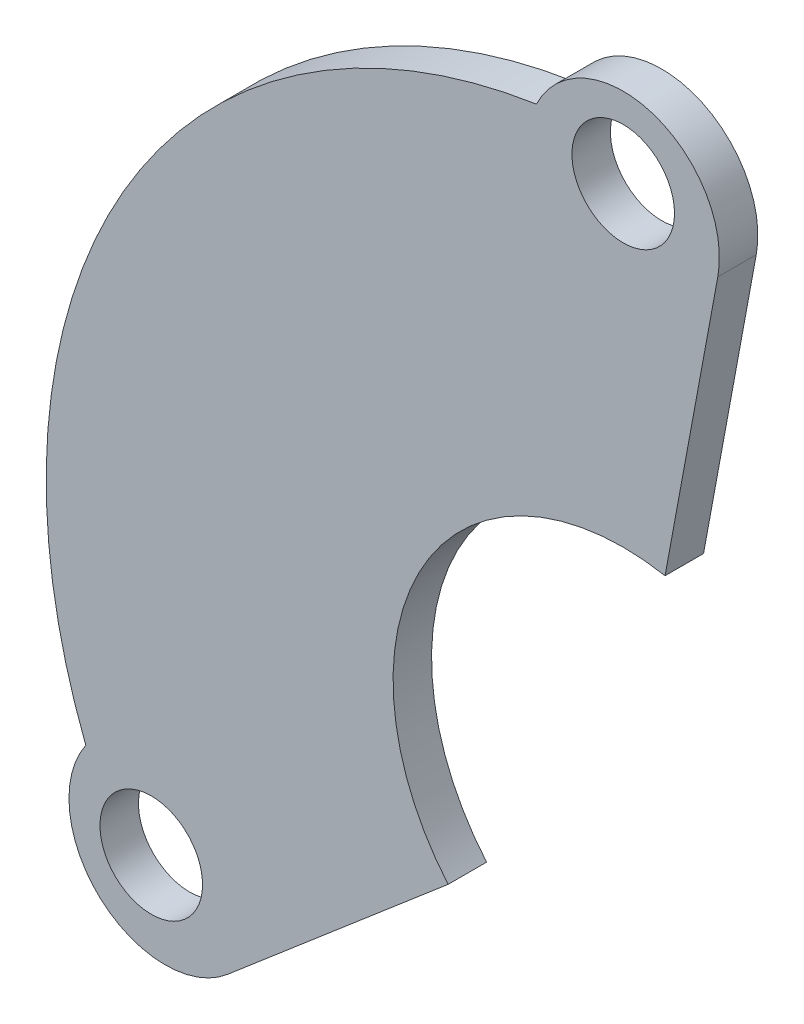
ISO-10303-21;
HEADER;
FILE_DESCRIPTION(('STEP AP214'),'2;1');
FILE_NAME('part.step','',(''),(''),'','','');
FILE_SCHEMA(('AUTOMOTIVE_DESIGN { 1 0 10303 214 1 1 1 1 }'));
ENDSEC;
DATA;
#1=APPLICATION_CONTEXT('core data for automotive mechanical design processes');
#2=APPLICATION_PROTOCOL_DEFINITION('international standard','automotive_design',2000,#1);
#3=PRODUCT_CONTEXT('',#1,'mechanical');
#4=PRODUCT('Part','Part','',(#3));
#5=PRODUCT_RELATED_PRODUCT_CATEGORY('part','',(#4));
#6=PRODUCT_DEFINITION_FORMATION('','',#4);
#7=PRODUCT_DEFINITION_CONTEXT('part definition',#1,'design');
#8=PRODUCT_DEFINITION('design','',#6,#7);
#9=PRODUCT_DEFINITION_SHAPE('','',#8);
#10=(LENGTH_UNIT() NAMED_UNIT(*) SI_UNIT(.MILLI.,.METRE.));
#11=(NAMED_UNIT(*) PLANE_ANGLE_UNIT() SI_UNIT($,.RADIAN.));
#12=(NAMED_UNIT(*) SI_UNIT($,.STERADIAN.) SOLID_ANGLE_UNIT());
#13=UNCERTAINTY_MEASURE_WITH_UNIT(LENGTH_MEASURE(1.E-05),#10,'distance_accuracy_value','');
#14=(GEOMETRIC_REPRESENTATION_CONTEXT(3) GLOBAL_UNCERTAINTY_ASSIGNED_CONTEXT((#13)) GLOBAL_UNIT_ASSIGNED_CONTEXT((#10,
#11,#12)) REPRESENTATION_CONTEXT('',''));
#15=CARTESIAN_POINT('',(0.,0.,0.));
#16=DIRECTION('',(0.,0.,1.));
#17=DIRECTION('',(1.,0.,0.));
#18=AXIS2_PLACEMENT_3D('',#15,#16,#17);
#19=CARTESIAN_POINT('',(0.,8.25,1.2));
#20=DIRECTION('',(0.,0.,1.));
#21=DIRECTION('',(1.,0.,0.));
#22=AXIS2_PLACEMENT_3D('',#19,#20,#21);
#23=PLANE('',#22);
#24=CARTESIAN_POINT('',(-14.7224318643344,-8.50000000000063,1.2));
#25=DIRECTION('',(0.,0.,1.));
#26=DIRECTION('',(1.,0.,0.));
#27=AXIS2_PLACEMENT_3D('',#24,#25,#26);
#28=CIRCLE('',#27,1.60000000000137);
#29=CARTESIAN_POINT('',(-13.122431864333,-8.50000000000063,1.2));
#30=VERTEX_POINT('',#29);
#31=EDGE_CURVE('E131',#30,#30,#28,.T.);
#32=ORIENTED_EDGE('',*,*,#31,.F.);
#33=EDGE_LOOP('',(#32));
#34=FACE_BOUND('',#33,.T.);
#35=CARTESIAN_POINT('',(0.,17.,1.2));
#36=DIRECTION('',(0.,0.,1.));
#37=DIRECTION('',(1.,0.,0.));
#38=AXIS2_PLACEMENT_3D('',#35,#36,#37);
#39=CIRCLE('',#38,1.6);
#40=CARTESIAN_POINT('',(1.6,17.,1.2));
#41=VERTEX_POINT('',#40);
#42=EDGE_CURVE('E132',#41,#41,#39,.T.);
#43=ORIENTED_EDGE('',*,*,#42,.F.);
#44=EDGE_LOOP('',(#43));
#45=FACE_BOUND('',#44,.T.);
#46=CARTESIAN_POINT('',(-14.2894191624422,-8.25000000000061,1.2));
#47=DIRECTION('',(0.,0.,1.));
#48=DIRECTION('',(1.,0.,0.));
#49=AXIS2_PLACEMENT_3D('',#46,#47,#48);
#50=CIRCLE('',#49,3.00000000000133);
#51=CARTESIAN_POINT('',(-16.7642567195948,-6.55436470144291,1.2));
#52=VERTEX_POINT('',#51);
#53=CARTESIAN_POINT('',(-12.3420434204153,-10.5320446357094,1.20000000000001));
#54=VERTEX_POINT('',#53);
#55=EDGE_CURVE('E153',#52,#54,#50,.T.);
#56=ORIENTED_EDGE('',*,*,#55,.T.);
#57=DIRECTION('',(-0.760681545236084,-0.649125247342332,0.));
#58=VECTOR('',#57,1.);
#59=CARTESIAN_POINT('',(4.07366516865099,3.47624959058226,1.2));
#60=LINE('',#59,#58);
#61=CARTESIAN_POINT('',(-5.46169349479508,-4.66071927591794,1.2));
#62=VERTEX_POINT('',#61);
#63=EDGE_CURVE('E110',#62,#54,#60,.T.);
#64=ORIENTED_EDGE('',*,*,#63,.F.);
#65=CARTESIAN_POINT('',(0.,0.,1.2));
#66=DIRECTION('',(0.,0.,1.));
#67=DIRECTION('',(1.,0.,0.));
#68=AXIS2_PLACEMENT_3D('',#65,#66,#67);
#69=CIRCLE('',#68,7.18);
#70=CARTESIAN_POINT('',(1.30545454545512,7.06032495213574,1.2));
#71=VERTEX_POINT('',#70);
#72=EDGE_CURVE('E140',#71,#62,#69,.T.);
#73=ORIENTED_EDGE('',*,*,#72,.F.);
#74=DIRECTION('',(0.181818181818262,0.983332166035619,0.));
#75=VECTOR('',#74,1.);
#76=CARTESIAN_POINT('',(1.47499824905408,7.97727272727249,1.2));
#77=LINE('',#76,#75);
#78=CARTESIAN_POINT('',(2.94999649810816,15.954545454545,1.20000000000001));
#79=VERTEX_POINT('',#78);
#80=EDGE_CURVE('E62',#71,#79,#77,.T.);
#81=ORIENTED_EDGE('',*,*,#80,.T.);
#82=CARTESIAN_POINT('',(0.,16.5,1.2));
#83=DIRECTION('',(0.,0.,1.));
#84=DIRECTION('',(1.,0.,0.));
#85=AXIS2_PLACEMENT_3D('',#82,#83,#84);
#86=CIRCLE('',#85,3.00000000000133);
#87=CARTESIAN_POINT('',(-2.70588202268129,17.7954545454543,1.2));
#88=VERTEX_POINT('',#87);
#89=EDGE_CURVE('E104',#79,#88,#86,.T.);
#90=ORIENTED_EDGE('',*,*,#89,.T.);
#91=CARTESIAN_POINT('',(0.,0.,1.2));
#92=DIRECTION('',(0.,0.,1.));
#93=DIRECTION('',(1.,0.,0.));
#94=AXIS2_PLACEMENT_3D('',#91,#92,#93);
#95=CIRCLE('',#94,18.);
#96=EDGE_CURVE('E150',#88,#52,#95,.T.);
#97=ORIENTED_EDGE('',*,*,#96,.T.);
#98=EDGE_LOOP('',(#56,#64,#73,#81,#90,#97));
#99=FACE_BOUND('',#98,.T.);
#100=ADVANCED_FACE('F39',(#34,#45,#99),#23,.T.);
#101=CARTESIAN_POINT('',(0.,8.25,0.));
#102=DIRECTION('',(0.,0.,1.));
#103=DIRECTION('',(1.,0.,0.));
#104=AXIS2_PLACEMENT_3D('',#101,#102,#103);
#105=PLANE('',#104);
#106=CARTESIAN_POINT('',(-14.7224318643344,-8.50000000000063,0.));
#107=DIRECTION('',(0.,0.,1.));
#108=DIRECTION('',(1.,0.,0.));
#109=AXIS2_PLACEMENT_3D('',#106,#107,#108);
#110=CIRCLE('',#109,1.60000000000137);
#111=CARTESIAN_POINT('',(-13.122431864333,-8.50000000000063,0.));
#112=VERTEX_POINT('',#111);
#113=EDGE_CURVE('E136',#112,#112,#110,.T.);
#114=ORIENTED_EDGE('',*,*,#113,.T.);
#115=EDGE_LOOP('',(#114));
#116=FACE_BOUND('',#115,.T.);
#117=CARTESIAN_POINT('',(0.,17.,0.));
#118=DIRECTION('',(0.,0.,1.));
#119=DIRECTION('',(1.,0.,0.));
#120=AXIS2_PLACEMENT_3D('',#117,#118,#119);
#121=CIRCLE('',#120,1.6);
#122=CARTESIAN_POINT('',(1.6,17.,0.));
#123=VERTEX_POINT('',#122);
#124=EDGE_CURVE('E147',#123,#123,#121,.T.);
#125=ORIENTED_EDGE('',*,*,#124,.T.);
#126=EDGE_LOOP('',(#125));
#127=FACE_BOUND('',#126,.T.);
#128=DIRECTION('',(0.760681545236084,0.649125247342332,0.));
#129=VECTOR('',#128,1.);
#130=CARTESIAN_POINT('',(0.,0.,0.));
#131=LINE('',#130,#129);
#132=CARTESIAN_POINT('',(-12.3420434204153,-10.5320446357094,0.));
#133=VERTEX_POINT('',#132);
#134=CARTESIAN_POINT('',(-5.46169349479508,-4.66071927591794,0.));
#135=VERTEX_POINT('',#134);
#136=EDGE_CURVE('E54',#133,#135,#131,.T.);
#137=ORIENTED_EDGE('',*,*,#136,.F.);
#138=CARTESIAN_POINT('',(-14.2894191624422,-8.25000000000061,0.));
#139=DIRECTION('',(0.,0.,1.));
#140=DIRECTION('',(1.,0.,0.));
#141=AXIS2_PLACEMENT_3D('',#138,#139,#140);
#142=CIRCLE('',#141,3.00000000000133);
#143=CARTESIAN_POINT('',(-16.7642567195948,-6.55436470144291,0.));
#144=VERTEX_POINT('',#143);
#145=EDGE_CURVE('E95',#144,#133,#142,.T.);
#146=ORIENTED_EDGE('',*,*,#145,.F.);
#147=CARTESIAN_POINT('',(0.,0.,0.));
#148=DIRECTION('',(0.,0.,1.));
#149=DIRECTION('',(1.,0.,0.));
#150=AXIS2_PLACEMENT_3D('',#147,#148,#149);
#151=CIRCLE('',#150,18.);
#152=CARTESIAN_POINT('',(-2.70588202268129,17.7954545454543,0.));
#153=VERTEX_POINT('',#152);
#154=EDGE_CURVE('E105',#153,#144,#151,.T.);
#155=ORIENTED_EDGE('',*,*,#154,.F.);
#156=CARTESIAN_POINT('',(0.,16.5,0.));
#157=DIRECTION('',(0.,0.,1.));
#158=DIRECTION('',(1.,0.,0.));
#159=AXIS2_PLACEMENT_3D('',#156,#157,#158);
#160=CIRCLE('',#159,3.00000000000133);
#161=CARTESIAN_POINT('',(2.94999649810816,15.954545454545,0.));
#162=VERTEX_POINT('',#161);
#163=EDGE_CURVE('E144',#162,#153,#160,.T.);
#164=ORIENTED_EDGE('',*,*,#163,.F.);
#165=DIRECTION('',(-0.181818181818262,-0.983332166035619,0.));
#166=VECTOR('',#165,1.);
#167=CARTESIAN_POINT('',(0.,0.,0.));
#168=LINE('',#167,#166);
#169=CARTESIAN_POINT('',(1.30545454545512,7.06032495213574,0.));
#170=VERTEX_POINT('',#169);
#171=EDGE_CURVE('E112',#162,#170,#168,.T.);
#172=ORIENTED_EDGE('',*,*,#171,.T.);
#173=CARTESIAN_POINT('',(0.,0.,0.));
#174=DIRECTION('',(0.,0.,1.));
#175=DIRECTION('',(1.,0.,0.));
#176=AXIS2_PLACEMENT_3D('',#173,#174,#175);
#177=CIRCLE('',#176,7.18);
#178=EDGE_CURVE('E119',#170,#135,#177,.T.);
#179=ORIENTED_EDGE('',*,*,#178,.T.);
#180=EDGE_LOOP('',(#137,#146,#155,#164,#172,#179));
#181=FACE_BOUND('',#180,.T.);
#182=ADVANCED_FACE('F116',(#116,#127,#181),#105,.F.);
#183=CARTESIAN_POINT('',(0.,16.5,1.2));
#184=DIRECTION('',(0.,0.,-1.));
#185=DIRECTION('',(-1.,0.,0.));
#186=AXIS2_PLACEMENT_3D('',#183,#184,#185);
#187=CYLINDRICAL_SURFACE('',#186,3.00000000000133);
#188=ORIENTED_EDGE('',*,*,#163,.T.);
#189=DIRECTION('',(0.,0.,-1.));
#190=VECTOR('',#189,1.);
#191=CARTESIAN_POINT('',(-2.70588202268129,17.7954545454543,1.2));
#192=LINE('',#191,#190);
#193=EDGE_CURVE('E162',#88,#153,#192,.T.);
#194=ORIENTED_EDGE('',*,*,#193,.F.);
#195=ORIENTED_EDGE('',*,*,#89,.F.);
#196=DIRECTION('',(0.,0.,1.));
#197=VECTOR('',#196,1.);
#198=CARTESIAN_POINT('',(2.94999649810816,15.954545454545,-71.322955316355));
#199=LINE('',#198,#197);
#200=EDGE_CURVE('E113',#162,#79,#199,.T.);
#201=ORIENTED_EDGE('',*,*,#200,.F.);
#202=EDGE_LOOP('',(#188,#194,#195,#201));
#203=FACE_BOUND('',#202,.T.);
#204=ADVANCED_FACE('F41',(#203),#187,.T.);
#205=CARTESIAN_POINT('',(0.,0.,1.2));
#206=DIRECTION('',(0.,0.,-1.));
#207=DIRECTION('',(-1.,0.,0.));
#208=AXIS2_PLACEMENT_3D('',#205,#206,#207);
#209=CYLINDRICAL_SURFACE('',#208,18.);
#210=ORIENTED_EDGE('',*,*,#154,.T.);
#211=DIRECTION('',(0.,0.,-1.));
#212=VECTOR('',#211,1.);
#213=CARTESIAN_POINT('',(-16.7642567195948,-6.55436470144291,1.2));
#214=LINE('',#213,#212);
#215=EDGE_CURVE('E100',#52,#144,#214,.T.);
#216=ORIENTED_EDGE('',*,*,#215,.F.);
#217=ORIENTED_EDGE('',*,*,#96,.F.);
#218=ORIENTED_EDGE('',*,*,#193,.T.);
#219=EDGE_LOOP('',(#210,#216,#217,#218));
#220=FACE_BOUND('',#219,.T.);
#221=ADVANCED_FACE('F180',(#220),#209,.T.);
#222=CARTESIAN_POINT('',(-14.2894191624422,-8.25000000000061,1.2));
#223=DIRECTION('',(0.,0.,-1.));
#224=DIRECTION('',(-1.,0.,0.));
#225=AXIS2_PLACEMENT_3D('',#222,#223,#224);
#226=CYLINDRICAL_SURFACE('',#225,3.00000000000133);
#227=ORIENTED_EDGE('',*,*,#145,.T.);
#228=DIRECTION('',(0.,0.,1.));
#229=VECTOR('',#228,1.);
#230=CARTESIAN_POINT('',(-12.3420434204153,-10.5320446357094,-71.322955316355));
#231=LINE('',#230,#229);
#232=EDGE_CURVE('E98',#133,#54,#231,.T.);
#233=ORIENTED_EDGE('',*,*,#232,.T.);
#234=ORIENTED_EDGE('',*,*,#55,.F.);
#235=ORIENTED_EDGE('',*,*,#215,.T.);
#236=EDGE_LOOP('',(#227,#233,#234,#235));
#237=FACE_BOUND('',#236,.T.);
#238=ADVANCED_FACE('F96',(#237),#226,.T.);
#239=CARTESIAN_POINT('',(0.,0.,1.2));
#240=DIRECTION('',(0.,0.,-1.));
#241=DIRECTION('',(-1.,0.,0.));
#242=AXIS2_PLACEMENT_3D('',#239,#240,#241);
#243=CYLINDRICAL_SURFACE('',#242,7.18);
#244=DIRECTION('',(0.,0.,-1.));
#245=VECTOR('',#244,1.);
#246=CARTESIAN_POINT('',(-5.46169349479508,-4.66071927591794,1.2));
#247=LINE('',#246,#245);
#248=EDGE_CURVE('E11',#135,#62,#247,.F.);
#249=ORIENTED_EDGE('',*,*,#248,.F.);
#250=ORIENTED_EDGE('',*,*,#178,.F.);
#251=DIRECTION('',(0.,0.,-1.));
#252=VECTOR('',#251,1.);
#253=CARTESIAN_POINT('',(1.30545454545512,7.06032495213574,1.2));
#254=LINE('',#253,#252);
#255=EDGE_CURVE('E48',#170,#71,#254,.F.);
#256=ORIENTED_EDGE('',*,*,#255,.T.);
#257=ORIENTED_EDGE('',*,*,#72,.T.);
#258=EDGE_LOOP('',(#249,#250,#256,#257));
#259=FACE_BOUND('',#258,.T.);
#260=ADVANCED_FACE('F174',(#259),#243,.F.);
#261=CARTESIAN_POINT('',(-14.7224318643344,-8.50000000000063,-8.8));
#262=DIRECTION('',(0.,0.,1.));
#263=DIRECTION('',(1.,0.,0.));
#264=AXIS2_PLACEMENT_3D('',#261,#262,#263);
#265=CYLINDRICAL_SURFACE('',#264,1.60000000000137);
#266=ORIENTED_EDGE('',*,*,#31,.T.);
#267=EDGE_LOOP('',(#266));
#268=FACE_BOUND('',#267,.T.);
#269=ORIENTED_EDGE('',*,*,#113,.F.);
#270=EDGE_LOOP('',(#269));
#271=FACE_BOUND('',#270,.T.);
#272=ADVANCED_FACE('F205',(#268,#271),#265,.F.);
#273=CARTESIAN_POINT('',(0.,17.,-8.8));
#274=DIRECTION('',(0.,0.,1.));
#275=DIRECTION('',(1.,0.,0.));
#276=AXIS2_PLACEMENT_3D('',#273,#274,#275);
#277=CYLINDRICAL_SURFACE('',#276,1.6);
#278=ORIENTED_EDGE('',*,*,#42,.T.);
#279=EDGE_LOOP('',(#278));
#280=FACE_BOUND('',#279,.T.);
#281=ORIENTED_EDGE('',*,*,#124,.F.);
#282=EDGE_LOOP('',(#281));
#283=FACE_BOUND('',#282,.T.);
#284=ADVANCED_FACE('F209',(#280,#283),#277,.F.);
#285=CARTESIAN_POINT('',(0.,0.,-71.322955316355));
#286=DIRECTION('',(0.983332166035618,-0.181818181818262,0.));
#287=DIRECTION('',(0.181818181818262,0.983332166035619,0.));
#288=AXIS2_PLACEMENT_3D('',#285,#286,#287);
#289=PLANE('',#288);
#290=ORIENTED_EDGE('',*,*,#255,.F.);
#291=ORIENTED_EDGE('',*,*,#171,.F.);
#292=ORIENTED_EDGE('',*,*,#200,.T.);
#293=ORIENTED_EDGE('',*,*,#80,.F.);
#294=EDGE_LOOP('',(#290,#291,#292,#293));
#295=FACE_BOUND('',#294,.T.);
#296=ADVANCED_FACE('F183',(#295),#289,.T.);
#297=CARTESIAN_POINT('',(0.,0.,-71.322955316355));
#298=DIRECTION('',(-0.649125247342332,0.760681545236084,0.));
#299=DIRECTION('',(-0.760681545236084,-0.649125247342332,0.));
#300=AXIS2_PLACEMENT_3D('',#297,#298,#299);
#301=PLANE('',#300);
#302=ORIENTED_EDGE('',*,*,#63,.T.);
#303=ORIENTED_EDGE('',*,*,#232,.F.);
#304=ORIENTED_EDGE('',*,*,#136,.T.);
#305=ORIENTED_EDGE('',*,*,#248,.T.);
#306=EDGE_LOOP('',(#302,#303,#304,#305));
#307=FACE_BOUND('',#306,.T.);
#308=ADVANCED_FACE('F108',(#307),#301,.F.);
#309=CLOSED_SHELL('',(#100,#182,#204,#221,#238,#260,#272,#284,#296,#308));
#310=MANIFOLD_SOLID_BREP('B2',#309);
#311=ADVANCED_BREP_SHAPE_REPRESENTATION('',(#18,#310),#14);
#312=SHAPE_DEFINITION_REPRESENTATION(#9,#311);
ENDSEC;
END-ISO-10303-21;
